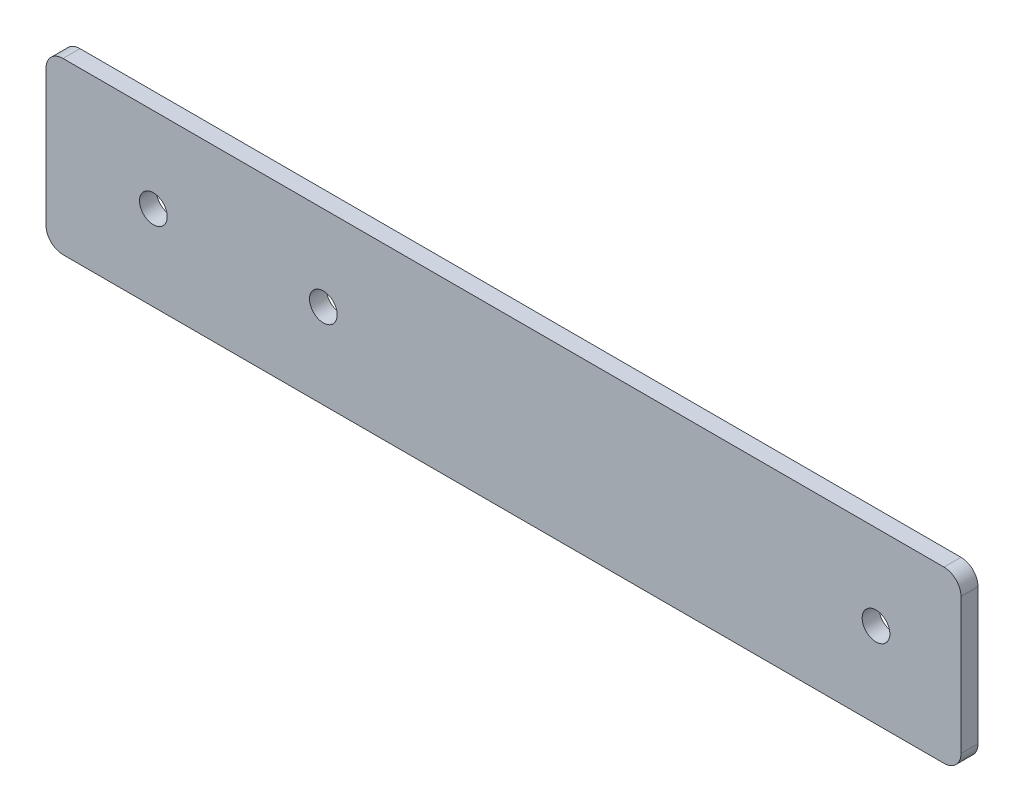
ISO-10303-21;
HEADER;
FILE_DESCRIPTION(('STEP AP214'),'2;1');
FILE_NAME('part.step','',(''),(''),'','','');
FILE_SCHEMA(('AUTOMOTIVE_DESIGN { 1 0 10303 214 1 1 1 1 }'));
ENDSEC;
DATA;
#1=APPLICATION_CONTEXT('core data for automotive mechanical design processes');
#2=APPLICATION_PROTOCOL_DEFINITION('international standard','automotive_design',2000,#1);
#3=PRODUCT_CONTEXT('',#1,'mechanical');
#4=PRODUCT('Part','Part','',(#3));
#5=PRODUCT_RELATED_PRODUCT_CATEGORY('part','',(#4));
#6=PRODUCT_DEFINITION_FORMATION('','',#4);
#7=PRODUCT_DEFINITION_CONTEXT('part definition',#1,'design');
#8=PRODUCT_DEFINITION('design','',#6,#7);
#9=PRODUCT_DEFINITION_SHAPE('','',#8);
#10=(LENGTH_UNIT() NAMED_UNIT(*) SI_UNIT(.MILLI.,.METRE.));
#11=(NAMED_UNIT(*) PLANE_ANGLE_UNIT() SI_UNIT($,.RADIAN.));
#12=(NAMED_UNIT(*) SI_UNIT($,.STERADIAN.) SOLID_ANGLE_UNIT());
#13=UNCERTAINTY_MEASURE_WITH_UNIT(LENGTH_MEASURE(1.E-05),#10,'distance_accuracy_value','');
#14=(GEOMETRIC_REPRESENTATION_CONTEXT(3) GLOBAL_UNCERTAINTY_ASSIGNED_CONTEXT((#13)) GLOBAL_UNIT_ASSIGNED_CONTEXT((#10,
#11,#12)) REPRESENTATION_CONTEXT('',''));
#15=CARTESIAN_POINT('',(0.,0.,0.));
#16=DIRECTION('',(0.,0.,1.));
#17=DIRECTION('',(1.,0.,0.));
#18=AXIS2_PLACEMENT_3D('',#15,#16,#17);
#19=CARTESIAN_POINT('',(0.,0.,2.54));
#20=DIRECTION('',(0.,0.,-1.));
#21=DIRECTION('',(-1.,0.,0.));
#22=AXIS2_PLACEMENT_3D('',#19,#20,#21);
#23=PLANE('',#22);
#24=DIRECTION('',(0.,1.,0.));
#25=VECTOR('',#24,1.);
#26=CARTESIAN_POINT('',(17.7896282413869,202.301133888924,2.54));
#27=LINE('',#26,#25);
#28=CARTESIAN_POINT('',(17.7896282413869,179.441133888924,2.54));
#29=VERTEX_POINT('',#28);
#30=CARTESIAN_POINT('',(17.7896282413869,199.761133888924,2.54));
#31=VERTEX_POINT('',#30);
#32=EDGE_CURVE('E136',#29,#31,#27,.T.);
#33=ORIENTED_EDGE('',*,*,#32,.T.);
#34=CARTESIAN_POINT('',(15.2496282413869,199.761133888924,2.54));
#35=DIRECTION('',(0.,0.,-1.));
#36=DIRECTION('',(-1.,0.,0.));
#37=AXIS2_PLACEMENT_3D('',#34,#35,#36);
#38=CIRCLE('',#37,2.54);
#39=CARTESIAN_POINT('',(15.2496282413869,202.301133888924,2.54));
#40=VERTEX_POINT('',#39);
#41=EDGE_CURVE('E155',#31,#40,#38,.F.);
#42=ORIENTED_EDGE('',*,*,#41,.T.);
#43=DIRECTION('',(-1.,0.,0.));
#44=VECTOR('',#43,1.);
#45=CARTESIAN_POINT('',(-118.938398372896,202.301133888924,2.54));
#46=LINE('',#45,#44);
#47=CARTESIAN_POINT('',(-116.398398372896,202.301133888924,2.54));
#48=VERTEX_POINT('',#47);
#49=EDGE_CURVE('E119',#40,#48,#46,.T.);
#50=ORIENTED_EDGE('',*,*,#49,.T.);
#51=CARTESIAN_POINT('',(-116.398398372896,199.761133888924,2.54));
#52=DIRECTION('',(0.,0.,-1.));
#53=DIRECTION('',(-1.,0.,0.));
#54=AXIS2_PLACEMENT_3D('',#51,#52,#53);
#55=CIRCLE('',#54,2.54);
#56=CARTESIAN_POINT('',(-118.938398372896,199.761133888924,2.54));
#57=VERTEX_POINT('',#56);
#58=EDGE_CURVE('E150',#48,#57,#55,.F.);
#59=ORIENTED_EDGE('',*,*,#58,.T.);
#60=DIRECTION('',(0.,-1.,0.));
#61=VECTOR('',#60,1.);
#62=CARTESIAN_POINT('',(-118.938398372896,176.901133888924,2.54));
#63=LINE('',#62,#61);
#64=CARTESIAN_POINT('',(-118.938398372896,179.441133888924,2.54));
#65=VERTEX_POINT('',#64);
#66=EDGE_CURVE('E166',#57,#65,#63,.T.);
#67=ORIENTED_EDGE('',*,*,#66,.T.);
#68=CARTESIAN_POINT('',(-116.398398372896,179.441133888924,2.54));
#69=DIRECTION('',(0.,0.,-1.));
#70=DIRECTION('',(-1.,0.,0.));
#71=AXIS2_PLACEMENT_3D('',#68,#69,#70);
#72=CIRCLE('',#71,2.54);
#73=CARTESIAN_POINT('',(-116.398398372896,176.901133888924,2.54));
#74=VERTEX_POINT('',#73);
#75=EDGE_CURVE('E55',#65,#74,#72,.F.);
#76=ORIENTED_EDGE('',*,*,#75,.T.);
#77=DIRECTION('',(1.,0.,0.));
#78=VECTOR('',#77,1.);
#79=CARTESIAN_POINT('',(17.7896282413869,176.901133888924,2.54));
#80=LINE('',#79,#78);
#81=CARTESIAN_POINT('',(15.2496282413869,176.901133888924,2.54));
#82=VERTEX_POINT('',#81);
#83=EDGE_CURVE('E174',#74,#82,#80,.T.);
#84=ORIENTED_EDGE('',*,*,#83,.T.);
#85=CARTESIAN_POINT('',(15.2496282413869,179.441133888924,2.54));
#86=DIRECTION('',(0.,0.,-1.));
#87=DIRECTION('',(-1.,0.,0.));
#88=AXIS2_PLACEMENT_3D('',#85,#86,#87);
#89=CIRCLE('',#88,2.54);
#90=EDGE_CURVE('E153',#82,#29,#89,.F.);
#91=ORIENTED_EDGE('',*,*,#90,.T.);
#92=EDGE_LOOP('',(#33,#42,#50,#59,#67,#76,#84,#91));
#93=FACE_BOUND('',#92,.T.);
#94=CARTESIAN_POINT('',(5.08961791705431,189.601133889115,2.54));
#95=DIRECTION('',(0.,0.,1.));
#96=DIRECTION('',(1.,0.,0.));
#97=AXIS2_PLACEMENT_3D('',#94,#95,#96);
#98=CIRCLE('',#97,2.07009999999997);
#99=CARTESIAN_POINT('',(7.15971791705428,189.601133889115,2.54));
#100=VERTEX_POINT('',#99);
#101=EDGE_CURVE('E127',#100,#100,#98,.T.);
#102=ORIENTED_EDGE('',*,*,#101,.F.);
#103=EDGE_LOOP('',(#102));
#104=FACE_BOUND('',#103,.T.);
#105=CARTESIAN_POINT('',(-77.4929399038571,189.601134208429,2.54));
#106=DIRECTION('',(0.,0.,1.));
#107=DIRECTION('',(1.,0.,0.));
#108=AXIS2_PLACEMENT_3D('',#105,#106,#107);
#109=CIRCLE('',#108,2.07009999999998);
#110=CARTESIAN_POINT('',(-75.4228399038572,189.601134208429,2.54));
#111=VERTEX_POINT('',#110);
#112=EDGE_CURVE('E181',#111,#111,#109,.T.);
#113=ORIENTED_EDGE('',*,*,#112,.F.);
#114=EDGE_LOOP('',(#113));
#115=FACE_BOUND('',#114,.T.);
#116=CARTESIAN_POINT('',(-102.892939903857,189.601134208413,2.54));
#117=DIRECTION('',(0.,0.,1.));
#118=DIRECTION('',(1.,0.,0.));
#119=AXIS2_PLACEMENT_3D('',#116,#117,#118);
#120=CIRCLE('',#119,2.07009999999998);
#121=CARTESIAN_POINT('',(-100.822839903857,189.601134208413,2.54));
#122=VERTEX_POINT('',#121);
#123=EDGE_CURVE('E186',#122,#122,#120,.T.);
#124=ORIENTED_EDGE('',*,*,#123,.F.);
#125=EDGE_LOOP('',(#124));
#126=FACE_BOUND('',#125,.T.);
#127=ADVANCED_FACE('F33',(#93,#104,#115,#126),#23,.F.);
#128=CARTESIAN_POINT('',(0.,0.,0.));
#129=DIRECTION('',(0.,0.,-1.));
#130=DIRECTION('',(-1.,0.,0.));
#131=AXIS2_PLACEMENT_3D('',#128,#129,#130);
#132=PLANE('',#131);
#133=CARTESIAN_POINT('',(-77.4929399038571,189.601134208429,0.));
#134=DIRECTION('',(0.,0.,1.));
#135=DIRECTION('',(1.,0.,0.));
#136=AXIS2_PLACEMENT_3D('',#133,#134,#135);
#137=CIRCLE('',#136,2.07009999999998);
#138=CARTESIAN_POINT('',(-75.4228399038572,189.601134208429,0.));
#139=VERTEX_POINT('',#138);
#140=EDGE_CURVE('E183',#139,#139,#137,.T.);
#141=ORIENTED_EDGE('',*,*,#140,.T.);
#142=EDGE_LOOP('',(#141));
#143=FACE_BOUND('',#142,.T.);
#144=DIRECTION('',(-1.,0.,0.));
#145=VECTOR('',#144,1.);
#146=CARTESIAN_POINT('',(-118.938398372896,202.301133888924,0.));
#147=LINE('',#146,#145);
#148=CARTESIAN_POINT('',(15.2496282413869,202.301133888924,0.));
#149=VERTEX_POINT('',#148);
#150=CARTESIAN_POINT('',(-116.398398372896,202.301133888924,0.));
#151=VERTEX_POINT('',#150);
#152=EDGE_CURVE('E116',#149,#151,#147,.T.);
#153=ORIENTED_EDGE('',*,*,#152,.F.);
#154=CARTESIAN_POINT('',(15.2496282413869,199.761133888924,0.));
#155=DIRECTION('',(0.,0.,-1.));
#156=DIRECTION('',(-1.,0.,0.));
#157=AXIS2_PLACEMENT_3D('',#154,#155,#156);
#158=CIRCLE('',#157,2.54);
#159=CARTESIAN_POINT('',(17.7896282413869,199.761133888924,0.));
#160=VERTEX_POINT('',#159);
#161=EDGE_CURVE('E99',#149,#160,#158,.T.);
#162=ORIENTED_EDGE('',*,*,#161,.T.);
#163=DIRECTION('',(0.,1.,0.));
#164=VECTOR('',#163,1.);
#165=CARTESIAN_POINT('',(17.7896282413869,202.301133888924,0.));
#166=LINE('',#165,#164);
#167=CARTESIAN_POINT('',(17.7896282413869,179.441133888924,0.));
#168=VERTEX_POINT('',#167);
#169=EDGE_CURVE('E140',#168,#160,#166,.T.);
#170=ORIENTED_EDGE('',*,*,#169,.F.);
#171=CARTESIAN_POINT('',(15.2496282413869,179.441133888924,0.));
#172=DIRECTION('',(0.,0.,-1.));
#173=DIRECTION('',(-1.,0.,0.));
#174=AXIS2_PLACEMENT_3D('',#171,#172,#173);
#175=CIRCLE('',#174,2.54);
#176=CARTESIAN_POINT('',(15.2496282413869,176.901133888924,0.));
#177=VERTEX_POINT('',#176);
#178=EDGE_CURVE('E110',#168,#177,#175,.T.);
#179=ORIENTED_EDGE('',*,*,#178,.T.);
#180=DIRECTION('',(1.,0.,0.));
#181=VECTOR('',#180,1.);
#182=CARTESIAN_POINT('',(17.7896282413869,176.901133888924,0.));
#183=LINE('',#182,#181);
#184=CARTESIAN_POINT('',(-116.398398372896,176.901133888924,0.));
#185=VERTEX_POINT('',#184);
#186=EDGE_CURVE('E130',#185,#177,#183,.T.);
#187=ORIENTED_EDGE('',*,*,#186,.F.);
#188=CARTESIAN_POINT('',(-116.398398372896,179.441133888924,0.));
#189=DIRECTION('',(0.,0.,-1.));
#190=DIRECTION('',(-1.,0.,0.));
#191=AXIS2_PLACEMENT_3D('',#188,#189,#190);
#192=CIRCLE('',#191,2.54);
#193=CARTESIAN_POINT('',(-118.938398372896,179.441133888924,0.));
#194=VERTEX_POINT('',#193);
#195=EDGE_CURVE('E144',#185,#194,#192,.T.);
#196=ORIENTED_EDGE('',*,*,#195,.T.);
#197=DIRECTION('',(0.,-1.,0.));
#198=VECTOR('',#197,1.);
#199=CARTESIAN_POINT('',(-118.938398372896,176.901133888924,0.));
#200=LINE('',#199,#198);
#201=CARTESIAN_POINT('',(-118.938398372896,199.761133888924,0.));
#202=VERTEX_POINT('',#201);
#203=EDGE_CURVE('E126',#202,#194,#200,.T.);
#204=ORIENTED_EDGE('',*,*,#203,.F.);
#205=CARTESIAN_POINT('',(-116.398398372896,199.761133888924,0.));
#206=DIRECTION('',(0.,0.,-1.));
#207=DIRECTION('',(-1.,0.,0.));
#208=AXIS2_PLACEMENT_3D('',#205,#206,#207);
#209=CIRCLE('',#208,2.54);
#210=EDGE_CURVE('E120',#202,#151,#209,.T.);
#211=ORIENTED_EDGE('',*,*,#210,.T.);
#212=EDGE_LOOP('',(#153,#162,#170,#179,#187,#196,#204,#211));
#213=FACE_BOUND('',#212,.T.);
#214=CARTESIAN_POINT('',(5.08961791705431,189.601133889115,0.));
#215=DIRECTION('',(0.,0.,1.));
#216=DIRECTION('',(1.,0.,0.));
#217=AXIS2_PLACEMENT_3D('',#214,#215,#216);
#218=CIRCLE('',#217,2.07009999999997);
#219=CARTESIAN_POINT('',(7.15971791705428,189.601133889115,0.));
#220=VERTEX_POINT('',#219);
#221=EDGE_CURVE('E133',#220,#220,#218,.T.);
#222=ORIENTED_EDGE('',*,*,#221,.T.);
#223=EDGE_LOOP('',(#222));
#224=FACE_BOUND('',#223,.T.);
#225=CARTESIAN_POINT('',(-102.892939903857,189.601134208413,0.));
#226=DIRECTION('',(0.,0.,1.));
#227=DIRECTION('',(1.,0.,0.));
#228=AXIS2_PLACEMENT_3D('',#225,#226,#227);
#229=CIRCLE('',#228,2.07009999999998);
#230=CARTESIAN_POINT('',(-100.822839903857,189.601134208413,0.));
#231=VERTEX_POINT('',#230);
#232=EDGE_CURVE('E189',#231,#231,#229,.T.);
#233=ORIENTED_EDGE('',*,*,#232,.T.);
#234=EDGE_LOOP('',(#233));
#235=FACE_BOUND('',#234,.T.);
#236=ADVANCED_FACE('F123',(#143,#213,#224,#235),#132,.T.);
#237=CARTESIAN_POINT('',(-118.938398372896,202.301133888924,2.54));
#238=DIRECTION('',(0.,-1.,0.));
#239=DIRECTION('',(0.,0.,-1.));
#240=AXIS2_PLACEMENT_3D('',#237,#238,#239);
#241=PLANE('',#240);
#242=ORIENTED_EDGE('',*,*,#49,.F.);
#243=DIRECTION('',(0.,0.,-1.));
#244=VECTOR('',#243,1.);
#245=CARTESIAN_POINT('',(15.2496282413869,202.301133888924,2.54));
#246=LINE('',#245,#244);
#247=EDGE_CURVE('E103',#40,#149,#246,.T.);
#248=ORIENTED_EDGE('',*,*,#247,.T.);
#249=ORIENTED_EDGE('',*,*,#152,.T.);
#250=DIRECTION('',(0.,0.,-1.));
#251=VECTOR('',#250,1.);
#252=CARTESIAN_POINT('',(-116.398398372896,202.301133888924,2.54));
#253=LINE('',#252,#251);
#254=EDGE_CURVE('E121',#151,#48,#253,.F.);
#255=ORIENTED_EDGE('',*,*,#254,.T.);
#256=EDGE_LOOP('',(#242,#248,#249,#255));
#257=FACE_BOUND('',#256,.T.);
#258=ADVANCED_FACE('F115',(#257),#241,.F.);
#259=CARTESIAN_POINT('',(-118.938398372896,176.901133888924,2.54));
#260=DIRECTION('',(1.,0.,0.));
#261=DIRECTION('',(0.,1.,0.));
#262=AXIS2_PLACEMENT_3D('',#259,#260,#261);
#263=PLANE('',#262);
#264=ORIENTED_EDGE('',*,*,#203,.T.);
#265=DIRECTION('',(0.,0.,-1.));
#266=VECTOR('',#265,1.);
#267=CARTESIAN_POINT('',(-118.938398372896,179.441133888924,2.54));
#268=LINE('',#267,#266);
#269=EDGE_CURVE('E11',#194,#65,#268,.F.);
#270=ORIENTED_EDGE('',*,*,#269,.T.);
#271=ORIENTED_EDGE('',*,*,#66,.F.);
#272=DIRECTION('',(0.,0.,-1.));
#273=VECTOR('',#272,1.);
#274=CARTESIAN_POINT('',(-118.938398372896,199.761133888924,2.54));
#275=LINE('',#274,#273);
#276=EDGE_CURVE('E41',#57,#202,#275,.T.);
#277=ORIENTED_EDGE('',*,*,#276,.T.);
#278=EDGE_LOOP('',(#264,#270,#271,#277));
#279=FACE_BOUND('',#278,.T.);
#280=ADVANCED_FACE('F164',(#279),#263,.F.);
#281=CARTESIAN_POINT('',(17.7896282413869,176.901133888924,2.54));
#282=DIRECTION('',(0.,1.,0.));
#283=DIRECTION('',(-1.,0.,0.));
#284=AXIS2_PLACEMENT_3D('',#281,#282,#283);
#285=PLANE('',#284);
#286=ORIENTED_EDGE('',*,*,#186,.T.);
#287=DIRECTION('',(0.,0.,-1.));
#288=VECTOR('',#287,1.);
#289=CARTESIAN_POINT('',(15.2496282413869,176.901133888924,2.54));
#290=LINE('',#289,#288);
#291=EDGE_CURVE('E48',#177,#82,#290,.F.);
#292=ORIENTED_EDGE('',*,*,#291,.T.);
#293=ORIENTED_EDGE('',*,*,#83,.F.);
#294=DIRECTION('',(0.,0.,-1.));
#295=VECTOR('',#294,1.);
#296=CARTESIAN_POINT('',(-116.398398372896,176.901133888924,2.54));
#297=LINE('',#296,#295);
#298=EDGE_CURVE('E157',#74,#185,#297,.T.);
#299=ORIENTED_EDGE('',*,*,#298,.T.);
#300=EDGE_LOOP('',(#286,#292,#293,#299));
#301=FACE_BOUND('',#300,.T.);
#302=ADVANCED_FACE('F173',(#301),#285,.F.);
#303=CARTESIAN_POINT('',(17.7896282413869,202.301133888924,2.54));
#304=DIRECTION('',(-1.,0.,0.));
#305=DIRECTION('',(0.,-1.,0.));
#306=AXIS2_PLACEMENT_3D('',#303,#304,#305);
#307=PLANE('',#306);
#308=ORIENTED_EDGE('',*,*,#169,.T.);
#309=DIRECTION('',(0.,0.,-1.));
#310=VECTOR('',#309,1.);
#311=CARTESIAN_POINT('',(17.7896282413869,199.761133888924,2.54));
#312=LINE('',#311,#310);
#313=EDGE_CURVE('E104',#160,#31,#312,.F.);
#314=ORIENTED_EDGE('',*,*,#313,.T.);
#315=ORIENTED_EDGE('',*,*,#32,.F.);
#316=DIRECTION('',(0.,0.,-1.));
#317=VECTOR('',#316,1.);
#318=CARTESIAN_POINT('',(17.7896282413869,179.441133888924,2.54));
#319=LINE('',#318,#317);
#320=EDGE_CURVE('E109',#29,#168,#319,.T.);
#321=ORIENTED_EDGE('',*,*,#320,.T.);
#322=EDGE_LOOP('',(#308,#314,#315,#321));
#323=FACE_BOUND('',#322,.T.);
#324=ADVANCED_FACE('F210',(#323),#307,.F.);
#325=CARTESIAN_POINT('',(5.08961791705431,189.601133889115,2.54));
#326=DIRECTION('',(0.,0.,-1.));
#327=DIRECTION('',(-1.,0.,0.));
#328=AXIS2_PLACEMENT_3D('',#325,#326,#327);
#329=CYLINDRICAL_SURFACE('',#328,2.07009999999997);
#330=ORIENTED_EDGE('',*,*,#101,.T.);
#331=EDGE_LOOP('',(#330));
#332=FACE_BOUND('',#331,.T.);
#333=ORIENTED_EDGE('',*,*,#221,.F.);
#334=EDGE_LOOP('',(#333));
#335=FACE_BOUND('',#334,.T.);
#336=ADVANCED_FACE('F207',(#332,#335),#329,.F.);
#337=CARTESIAN_POINT('',(-77.4929399038571,189.601134208429,2.54));
#338=DIRECTION('',(0.,0.,-1.));
#339=DIRECTION('',(-1.,0.,0.));
#340=AXIS2_PLACEMENT_3D('',#337,#338,#339);
#341=CYLINDRICAL_SURFACE('',#340,2.07009999999998);
#342=ORIENTED_EDGE('',*,*,#112,.T.);
#343=EDGE_LOOP('',(#342));
#344=FACE_BOUND('',#343,.T.);
#345=ORIENTED_EDGE('',*,*,#140,.F.);
#346=EDGE_LOOP('',(#345));
#347=FACE_BOUND('',#346,.T.);
#348=ADVANCED_FACE('F294',(#344,#347),#341,.F.);
#349=CARTESIAN_POINT('',(-102.892939903857,189.601134208413,2.54));
#350=DIRECTION('',(0.,0.,-1.));
#351=DIRECTION('',(-1.,0.,0.));
#352=AXIS2_PLACEMENT_3D('',#349,#350,#351);
#353=CYLINDRICAL_SURFACE('',#352,2.07009999999998);
#354=ORIENTED_EDGE('',*,*,#123,.T.);
#355=EDGE_LOOP('',(#354));
#356=FACE_BOUND('',#355,.T.);
#357=ORIENTED_EDGE('',*,*,#232,.F.);
#358=EDGE_LOOP('',(#357));
#359=FACE_BOUND('',#358,.T.);
#360=ADVANCED_FACE('F195',(#356,#359),#353,.F.);
#361=CARTESIAN_POINT('',(15.2496282413869,199.761133888924,2.54));
#362=DIRECTION('',(0.,0.,-1.));
#363=DIRECTION('',(-1.,0.,0.));
#364=AXIS2_PLACEMENT_3D('',#361,#362,#363);
#365=CYLINDRICAL_SURFACE('',#364,2.54);
#366=ORIENTED_EDGE('',*,*,#41,.F.);
#367=ORIENTED_EDGE('',*,*,#313,.F.);
#368=ORIENTED_EDGE('',*,*,#161,.F.);
#369=ORIENTED_EDGE('',*,*,#247,.F.);
#370=EDGE_LOOP('',(#366,#367,#368,#369));
#371=FACE_BOUND('',#370,.T.);
#372=ADVANCED_FACE('F102',(#371),#365,.T.);
#373=CARTESIAN_POINT('',(15.2496282413869,179.441133888924,2.54));
#374=DIRECTION('',(0.,0.,-1.));
#375=DIRECTION('',(-1.,0.,0.));
#376=AXIS2_PLACEMENT_3D('',#373,#374,#375);
#377=CYLINDRICAL_SURFACE('',#376,2.54);
#378=ORIENTED_EDGE('',*,*,#90,.F.);
#379=ORIENTED_EDGE('',*,*,#291,.F.);
#380=ORIENTED_EDGE('',*,*,#178,.F.);
#381=ORIENTED_EDGE('',*,*,#320,.F.);
#382=EDGE_LOOP('',(#378,#379,#380,#381));
#383=FACE_BOUND('',#382,.T.);
#384=ADVANCED_FACE('F222',(#383),#377,.T.);
#385=CARTESIAN_POINT('',(-116.398398372896,179.441133888924,2.54));
#386=DIRECTION('',(0.,0.,-1.));
#387=DIRECTION('',(-1.,0.,0.));
#388=AXIS2_PLACEMENT_3D('',#385,#386,#387);
#389=CYLINDRICAL_SURFACE('',#388,2.54);
#390=ORIENTED_EDGE('',*,*,#75,.F.);
#391=ORIENTED_EDGE('',*,*,#269,.F.);
#392=ORIENTED_EDGE('',*,*,#195,.F.);
#393=ORIENTED_EDGE('',*,*,#298,.F.);
#394=EDGE_LOOP('',(#390,#391,#392,#393));
#395=FACE_BOUND('',#394,.T.);
#396=ADVANCED_FACE('F172',(#395),#389,.T.);
#397=CARTESIAN_POINT('',(-116.398398372896,199.761133888924,2.54));
#398=DIRECTION('',(0.,0.,-1.));
#399=DIRECTION('',(-1.,0.,0.));
#400=AXIS2_PLACEMENT_3D('',#397,#398,#399);
#401=CYLINDRICAL_SURFACE('',#400,2.54);
#402=ORIENTED_EDGE('',*,*,#58,.F.);
#403=ORIENTED_EDGE('',*,*,#254,.F.);
#404=ORIENTED_EDGE('',*,*,#210,.F.);
#405=ORIENTED_EDGE('',*,*,#276,.F.);
#406=EDGE_LOOP('',(#402,#403,#404,#405));
#407=FACE_BOUND('',#406,.T.);
#408=ADVANCED_FACE('F35',(#407),#401,.T.);
#409=CLOSED_SHELL('',(#127,#236,#258,#280,#302,#324,#336,#348,#360,#372,#384,#396,#408));
#410=MANIFOLD_SOLID_BREP('B2',#409);
#411=ADVANCED_BREP_SHAPE_REPRESENTATION('',(#18,#410),#14);
#412=SHAPE_DEFINITION_REPRESENTATION(#9,#411);
ENDSEC;
END-ISO-10303-21;
